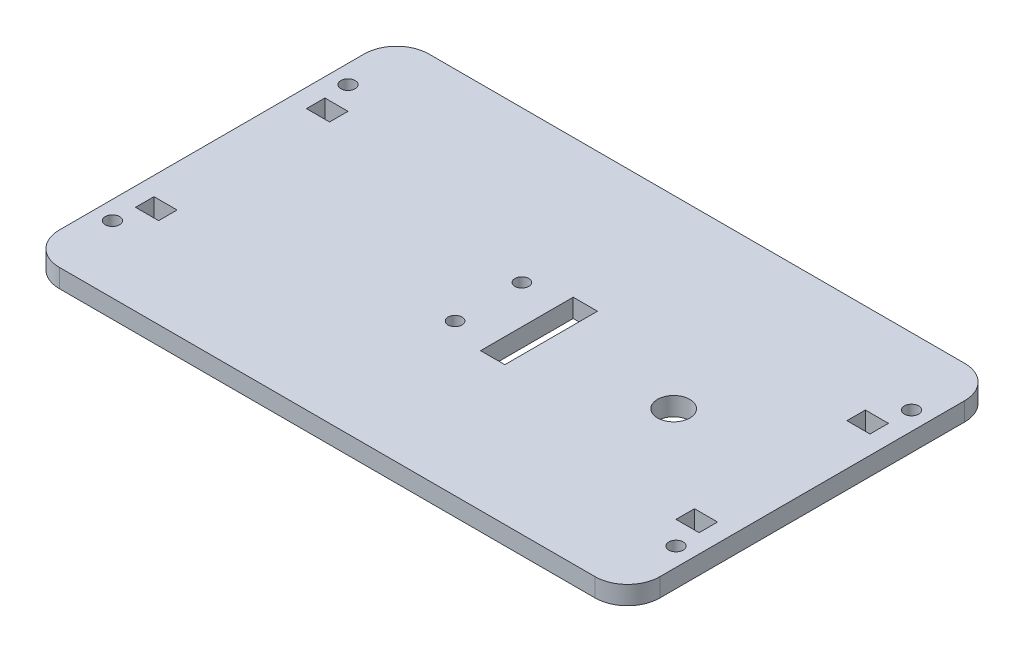
ISO-10303-21;
HEADER;
FILE_DESCRIPTION(('STEP AP214'),'2;1');
FILE_NAME('part.step','',(''),(''),'','','');
FILE_SCHEMA(('AUTOMOTIVE_DESIGN { 1 0 10303 214 1 1 1 1 }'));
ENDSEC;
DATA;
#1=APPLICATION_CONTEXT('core data for automotive mechanical design processes');
#2=APPLICATION_PROTOCOL_DEFINITION('international standard','automotive_design',2000,#1);
#3=PRODUCT_CONTEXT('',#1,'mechanical');
#4=PRODUCT('Part','Part','',(#3));
#5=PRODUCT_RELATED_PRODUCT_CATEGORY('part','',(#4));
#6=PRODUCT_DEFINITION_FORMATION('','',#4);
#7=PRODUCT_DEFINITION_CONTEXT('part definition',#1,'design');
#8=PRODUCT_DEFINITION('design','',#6,#7);
#9=PRODUCT_DEFINITION_SHAPE('','',#8);
#10=(LENGTH_UNIT() NAMED_UNIT(*) SI_UNIT(.MILLI.,.METRE.));
#11=(NAMED_UNIT(*) PLANE_ANGLE_UNIT() SI_UNIT($,.RADIAN.));
#12=(NAMED_UNIT(*) SI_UNIT($,.STERADIAN.) SOLID_ANGLE_UNIT());
#13=UNCERTAINTY_MEASURE_WITH_UNIT(LENGTH_MEASURE(1.E-05),#10,'distance_accuracy_value','');
#14=(GEOMETRIC_REPRESENTATION_CONTEXT(3) GLOBAL_UNCERTAINTY_ASSIGNED_CONTEXT((#13)) GLOBAL_UNIT_ASSIGNED_CONTEXT((#10,
#11,#12)) REPRESENTATION_CONTEXT('',''));
#15=CARTESIAN_POINT('',(0.,0.,0.));
#16=DIRECTION('',(0.,0.,1.));
#17=DIRECTION('',(1.,0.,0.));
#18=AXIS2_PLACEMENT_3D('',#15,#16,#17);
#19=CARTESIAN_POINT('',(58.,4.,-33.));
#20=DIRECTION('',(0.,-1.,0.));
#21=DIRECTION('',(0.,0.,-1.));
#22=AXIS2_PLACEMENT_3D('',#19,#20,#21);
#23=PLANE('',#22);
#24=CARTESIAN_POINT('',(-5.10000000000001,4.,-7.22749999999999));
#25=DIRECTION('',(0.,1.,0.));
#26=DIRECTION('',(0.,0.,1.));
#27=AXIS2_PLACEMENT_3D('',#24,#25,#26);
#28=CIRCLE('',#27,1.5);
#29=CARTESIAN_POINT('',(-5.10000000000001,4.,-5.72749999999999));
#30=VERTEX_POINT('',#29);
#31=EDGE_CURVE('E258',#30,#30,#28,.T.);
#32=ORIENTED_EDGE('',*,*,#31,.F.);
#33=EDGE_LOOP('',(#32));
#34=FACE_BOUND('',#33,.T.);
#35=CARTESIAN_POINT('',(-5.10000000000001,4.,7.22750000000001));
#36=DIRECTION('',(0.,1.,0.));
#37=DIRECTION('',(0.,0.,1.));
#38=AXIS2_PLACEMENT_3D('',#35,#36,#37);
#39=CIRCLE('',#38,1.5);
#40=CARTESIAN_POINT('',(-5.10000000000001,4.,8.72750000000001));
#41=VERTEX_POINT('',#40);
#42=EDGE_CURVE('E264',#41,#41,#39,.T.);
#43=ORIENTED_EDGE('',*,*,#42,.F.);
#44=EDGE_LOOP('',(#43));
#45=FACE_BOUND('',#44,.T.);
#46=CARTESIAN_POINT('',(-61.,4.,-25.5));
#47=DIRECTION('',(0.,1.,0.));
#48=DIRECTION('',(0.,0.,-1.));
#49=AXIS2_PLACEMENT_3D('',#46,#47,#48);
#50=CIRCLE('',#49,1.54999999999999);
#51=CARTESIAN_POINT('',(-61.,4.,-27.05));
#52=VERTEX_POINT('',#51);
#53=EDGE_CURVE('E270',#52,#52,#50,.T.);
#54=ORIENTED_EDGE('',*,*,#53,.F.);
#55=EDGE_LOOP('',(#54));
#56=FACE_BOUND('',#55,.T.);
#57=CARTESIAN_POINT('',(-61.,4.,25.5));
#58=DIRECTION('',(0.,1.,0.));
#59=DIRECTION('',(0.,0.,1.));
#60=AXIS2_PLACEMENT_3D('',#57,#58,#59);
#61=CIRCLE('',#60,1.54999999999999);
#62=CARTESIAN_POINT('',(-61.,4.,27.05));
#63=VERTEX_POINT('',#62);
#64=EDGE_CURVE('E276',#63,#63,#61,.T.);
#65=ORIENTED_EDGE('',*,*,#64,.F.);
#66=EDGE_LOOP('',(#65));
#67=FACE_BOUND('',#66,.T.);
#68=CARTESIAN_POINT('',(61.,4.,25.5));
#69=DIRECTION('',(0.,1.,0.));
#70=DIRECTION('',(0.,0.,-1.));
#71=AXIS2_PLACEMENT_3D('',#68,#69,#70);
#72=CIRCLE('',#71,1.54999999999999);
#73=CARTESIAN_POINT('',(61.,4.,23.95));
#74=VERTEX_POINT('',#73);
#75=EDGE_CURVE('E282',#74,#74,#72,.T.);
#76=ORIENTED_EDGE('',*,*,#75,.F.);
#77=EDGE_LOOP('',(#76));
#78=FACE_BOUND('',#77,.T.);
#79=CARTESIAN_POINT('',(61.,4.,-25.5));
#80=DIRECTION('',(0.,1.,0.));
#81=DIRECTION('',(0.,0.,1.));
#82=AXIS2_PLACEMENT_3D('',#79,#80,#81);
#83=CIRCLE('',#82,1.54999999999999);
#84=CARTESIAN_POINT('',(61.,4.,-23.95));
#85=VERTEX_POINT('',#84);
#86=EDGE_CURVE('E288',#85,#85,#83,.T.);
#87=ORIENTED_EDGE('',*,*,#86,.F.);
#88=EDGE_LOOP('',(#87));
#89=FACE_BOUND('',#88,.T.);
#90=DIRECTION('',(0.,0.,1.));
#91=VECTOR('',#90,1.);
#92=CARTESIAN_POINT('',(-61.,4.,-20.5));
#93=LINE('',#92,#91);
#94=CARTESIAN_POINT('',(-61.,4.,-20.5));
#95=VERTEX_POINT('',#94);
#96=CARTESIAN_POINT('',(-61.,4.,-16.5));
#97=VERTEX_POINT('',#96);
#98=EDGE_CURVE('E294',#95,#97,#93,.T.);
#99=ORIENTED_EDGE('',*,*,#98,.F.);
#100=DIRECTION('',(-1.,0.,0.));
#101=VECTOR('',#100,1.);
#102=CARTESIAN_POINT('',(-61.,4.,-20.5));
#103=LINE('',#102,#101);
#104=CARTESIAN_POINT('',(-56.,4.,-20.5));
#105=VERTEX_POINT('',#104);
#106=EDGE_CURVE('E302',#105,#95,#103,.T.);
#107=ORIENTED_EDGE('',*,*,#106,.F.);
#108=DIRECTION('',(0.,0.,-1.));
#109=VECTOR('',#108,1.);
#110=CARTESIAN_POINT('',(-56.,4.,-20.5));
#111=LINE('',#110,#109);
#112=CARTESIAN_POINT('',(-56.,4.,-16.5));
#113=VERTEX_POINT('',#112);
#114=EDGE_CURVE('E299',#113,#105,#111,.T.);
#115=ORIENTED_EDGE('',*,*,#114,.F.);
#116=DIRECTION('',(1.,0.,0.));
#117=VECTOR('',#116,1.);
#118=CARTESIAN_POINT('',(-61.,4.,-16.5));
#119=LINE('',#118,#117);
#120=EDGE_CURVE('E296',#97,#113,#119,.T.);
#121=ORIENTED_EDGE('',*,*,#120,.F.);
#122=EDGE_LOOP('',(#99,#107,#115,#121));
#123=FACE_BOUND('',#122,.T.);
#124=DIRECTION('',(0.,0.,-1.));
#125=VECTOR('',#124,1.);
#126=CARTESIAN_POINT('',(61.,4.,20.5));
#127=LINE('',#126,#125);
#128=CARTESIAN_POINT('',(61.,4.,20.5));
#129=VERTEX_POINT('',#128);
#130=CARTESIAN_POINT('',(61.,4.,16.5));
#131=VERTEX_POINT('',#130);
#132=EDGE_CURVE('E356',#129,#131,#127,.T.);
#133=ORIENTED_EDGE('',*,*,#132,.F.);
#134=DIRECTION('',(1.,0.,0.));
#135=VECTOR('',#134,1.);
#136=CARTESIAN_POINT('',(61.,4.,20.5));
#137=LINE('',#136,#135);
#138=CARTESIAN_POINT('',(56.,4.,20.5));
#139=VERTEX_POINT('',#138);
#140=EDGE_CURVE('E364',#139,#129,#137,.T.);
#141=ORIENTED_EDGE('',*,*,#140,.F.);
#142=DIRECTION('',(0.,0.,1.));
#143=VECTOR('',#142,1.);
#144=CARTESIAN_POINT('',(56.,4.,20.5));
#145=LINE('',#144,#143);
#146=CARTESIAN_POINT('',(56.,4.,16.5));
#147=VERTEX_POINT('',#146);
#148=EDGE_CURVE('E361',#147,#139,#145,.T.);
#149=ORIENTED_EDGE('',*,*,#148,.F.);
#150=DIRECTION('',(-1.,0.,0.));
#151=VECTOR('',#150,1.);
#152=CARTESIAN_POINT('',(61.,4.,16.5));
#153=LINE('',#152,#151);
#154=EDGE_CURVE('E358',#131,#147,#153,.T.);
#155=ORIENTED_EDGE('',*,*,#154,.F.);
#156=EDGE_LOOP('',(#133,#141,#149,#155));
#157=FACE_BOUND('',#156,.T.);
#158=CARTESIAN_POINT('',(58.,4.,-33.));
#159=DIRECTION('',(0.,1.,0.));
#160=DIRECTION('',(0.,0.,-1.));
#161=AXIS2_PLACEMENT_3D('',#158,#159,#160);
#162=CIRCLE('',#161,7.);
#163=CARTESIAN_POINT('',(65.,4.,-32.9999999999999));
#164=VERTEX_POINT('',#163);
#165=CARTESIAN_POINT('',(57.9999999999999,4.,-40.));
#166=VERTEX_POINT('',#165);
#167=EDGE_CURVE('E418',#164,#166,#162,.T.);
#168=ORIENTED_EDGE('',*,*,#167,.T.);
#169=DIRECTION('',(-1.,0.,0.));
#170=VECTOR('',#169,1.);
#171=CARTESIAN_POINT('',(-58.,4.,-40.));
#172=LINE('',#171,#170);
#173=CARTESIAN_POINT('',(-58.,4.,-40.));
#174=VERTEX_POINT('',#173);
#175=EDGE_CURVE('E421',#166,#174,#172,.T.);
#176=ORIENTED_EDGE('',*,*,#175,.T.);
#177=CARTESIAN_POINT('',(-58.,4.,-33.));
#178=DIRECTION('',(0.,1.,0.));
#179=DIRECTION('',(0.,0.,-1.));
#180=AXIS2_PLACEMENT_3D('',#177,#178,#179);
#181=CIRCLE('',#180,7.);
#182=CARTESIAN_POINT('',(-65.,4.,-32.9999999999999));
#183=VERTEX_POINT('',#182);
#184=EDGE_CURVE('E424',#174,#183,#181,.T.);
#185=ORIENTED_EDGE('',*,*,#184,.T.);
#186=DIRECTION('',(0.,0.,1.));
#187=VECTOR('',#186,1.);
#188=CARTESIAN_POINT('',(-65.,4.,33.));
#189=LINE('',#188,#187);
#190=CARTESIAN_POINT('',(-65.,4.,33.));
#191=VERTEX_POINT('',#190);
#192=EDGE_CURVE('E426',#183,#191,#189,.T.);
#193=ORIENTED_EDGE('',*,*,#192,.T.);
#194=CARTESIAN_POINT('',(-58.,4.,33.));
#195=DIRECTION('',(0.,1.,0.));
#196=DIRECTION('',(0.,0.,-1.));
#197=AXIS2_PLACEMENT_3D('',#194,#195,#196);
#198=CIRCLE('',#197,7.);
#199=CARTESIAN_POINT('',(-58.,4.,40.));
#200=VERTEX_POINT('',#199);
#201=EDGE_CURVE('E428',#191,#200,#198,.T.);
#202=ORIENTED_EDGE('',*,*,#201,.T.);
#203=DIRECTION('',(1.,0.,0.));
#204=VECTOR('',#203,1.);
#205=CARTESIAN_POINT('',(-58.,4.,40.));
#206=LINE('',#205,#204);
#207=CARTESIAN_POINT('',(57.9999999999999,4.,40.));
#208=VERTEX_POINT('',#207);
#209=EDGE_CURVE('E430',#200,#208,#206,.T.);
#210=ORIENTED_EDGE('',*,*,#209,.T.);
#211=CARTESIAN_POINT('',(58.,4.,33.));
#212=DIRECTION('',(0.,1.,0.));
#213=DIRECTION('',(0.,0.,1.));
#214=AXIS2_PLACEMENT_3D('',#211,#212,#213);
#215=CIRCLE('',#214,7.);
#216=CARTESIAN_POINT('',(65.,4.,33.));
#217=VERTEX_POINT('',#216);
#218=EDGE_CURVE('E432',#208,#217,#215,.T.);
#219=ORIENTED_EDGE('',*,*,#218,.T.);
#220=DIRECTION('',(0.,0.,-1.));
#221=VECTOR('',#220,1.);
#222=CARTESIAN_POINT('',(65.,4.,33.));
#223=LINE('',#222,#221);
#224=EDGE_CURVE('E434',#217,#164,#223,.T.);
#225=ORIENTED_EDGE('',*,*,#224,.T.);
#226=EDGE_LOOP('',(#168,#176,#185,#193,#202,#210,#219,#225));
#227=FACE_BOUND('',#226,.T.);
#228=DIRECTION('',(0.,0.,-1.));
#229=VECTOR('',#228,1.);
#230=CARTESIAN_POINT('',(61.,4.,-20.5));
#231=LINE('',#230,#229);
#232=CARTESIAN_POINT('',(61.,4.,-16.5));
#233=VERTEX_POINT('',#232);
#234=CARTESIAN_POINT('',(61.,4.,-20.5));
#235=VERTEX_POINT('',#234);
#236=EDGE_CURVE('E387',#233,#235,#231,.T.);
#237=ORIENTED_EDGE('',*,*,#236,.F.);
#238=DIRECTION('',(1.,0.,0.));
#239=VECTOR('',#238,1.);
#240=CARTESIAN_POINT('',(61.,4.,-16.5));
#241=LINE('',#240,#239);
#242=CARTESIAN_POINT('',(56.,4.,-16.5));
#243=VERTEX_POINT('',#242);
#244=EDGE_CURVE('E395',#243,#233,#241,.T.);
#245=ORIENTED_EDGE('',*,*,#244,.F.);
#246=DIRECTION('',(0.,0.,1.));
#247=VECTOR('',#246,1.);
#248=CARTESIAN_POINT('',(56.,4.,-20.5));
#249=LINE('',#248,#247);
#250=CARTESIAN_POINT('',(56.,4.,-20.5));
#251=VERTEX_POINT('',#250);
#252=EDGE_CURVE('E392',#251,#243,#249,.T.);
#253=ORIENTED_EDGE('',*,*,#252,.F.);
#254=DIRECTION('',(-1.,0.,0.));
#255=VECTOR('',#254,1.);
#256=CARTESIAN_POINT('',(61.,4.,-20.5));
#257=LINE('',#256,#255);
#258=EDGE_CURVE('E389',#235,#251,#257,.T.);
#259=ORIENTED_EDGE('',*,*,#258,.F.);
#260=EDGE_LOOP('',(#237,#245,#253,#259));
#261=FACE_BOUND('',#260,.T.);
#262=DIRECTION('',(1.,0.,0.));
#263=VECTOR('',#262,1.);
#264=CARTESIAN_POINT('',(-61.,4.,20.5));
#265=LINE('',#264,#263);
#266=CARTESIAN_POINT('',(-61.,4.,20.5));
#267=VERTEX_POINT('',#266);
#268=CARTESIAN_POINT('',(-56.,4.,20.5));
#269=VERTEX_POINT('',#268);
#270=EDGE_CURVE('E325',#267,#269,#265,.T.);
#271=ORIENTED_EDGE('',*,*,#270,.F.);
#272=DIRECTION('',(0.,0.,1.));
#273=VECTOR('',#272,1.);
#274=CARTESIAN_POINT('',(-61.,4.,20.5));
#275=LINE('',#274,#273);
#276=CARTESIAN_POINT('',(-61.,4.,16.5));
#277=VERTEX_POINT('',#276);
#278=EDGE_CURVE('E333',#277,#267,#275,.T.);
#279=ORIENTED_EDGE('',*,*,#278,.F.);
#280=DIRECTION('',(-1.,0.,0.));
#281=VECTOR('',#280,1.);
#282=CARTESIAN_POINT('',(-61.,4.,16.5));
#283=LINE('',#282,#281);
#284=CARTESIAN_POINT('',(-56.,4.,16.5));
#285=VERTEX_POINT('',#284);
#286=EDGE_CURVE('E330',#285,#277,#283,.T.);
#287=ORIENTED_EDGE('',*,*,#286,.F.);
#288=DIRECTION('',(0.,0.,-1.));
#289=VECTOR('',#288,1.);
#290=CARTESIAN_POINT('',(-56.,4.,20.5));
#291=LINE('',#290,#289);
#292=EDGE_CURVE('E327',#269,#285,#291,.T.);
#293=ORIENTED_EDGE('',*,*,#292,.F.);
#294=EDGE_LOOP('',(#271,#279,#287,#293));
#295=FACE_BOUND('',#294,.T.);
#296=DIRECTION('',(0.,0.,1.));
#297=VECTOR('',#296,1.);
#298=CARTESIAN_POINT('',(3.22232031120961,4.,-10.0275));
#299=LINE('',#298,#297);
#300=CARTESIAN_POINT('',(3.22232031120961,4.,-10.0275));
#301=VERTEX_POINT('',#300);
#302=CARTESIAN_POINT('',(3.22232031120962,4.,10.0275));
#303=VERTEX_POINT('',#302);
#304=EDGE_CURVE('E219',#301,#303,#299,.T.);
#305=ORIENTED_EDGE('',*,*,#304,.F.);
#306=DIRECTION('',(-1.,0.,0.));
#307=VECTOR('',#306,1.);
#308=CARTESIAN_POINT('',(3.22232031120961,4.,-10.0275));
#309=LINE('',#308,#307);
#310=CARTESIAN_POINT('',(8.47559016262878,4.,-10.0275));
#311=VERTEX_POINT('',#310);
#312=EDGE_CURVE('E242',#311,#301,#309,.T.);
#313=ORIENTED_EDGE('',*,*,#312,.F.);
#314=DIRECTION('',(0.,0.,-1.));
#315=VECTOR('',#314,1.);
#316=CARTESIAN_POINT('',(8.47559016262878,4.,-10.0275));
#317=LINE('',#316,#315);
#318=CARTESIAN_POINT('',(8.47559016262878,4.,10.0275));
#319=VERTEX_POINT('',#318);
#320=EDGE_CURVE('E240',#319,#311,#317,.T.);
#321=ORIENTED_EDGE('',*,*,#320,.F.);
#322=DIRECTION('',(1.,0.,0.));
#323=VECTOR('',#322,1.);
#324=CARTESIAN_POINT('',(3.22232031120962,4.,10.0275));
#325=LINE('',#324,#323);
#326=EDGE_CURVE('E227',#303,#319,#325,.T.);
#327=ORIENTED_EDGE('',*,*,#326,.F.);
#328=EDGE_LOOP('',(#305,#313,#321,#327));
#329=FACE_BOUND('',#328,.T.);
#330=CARTESIAN_POINT('',(35.,4.,0.));
#331=DIRECTION('',(0.,1.,0.));
#332=DIRECTION('',(0.,0.,1.));
#333=AXIS2_PLACEMENT_3D('',#330,#331,#332);
#334=CIRCLE('',#333,3.5);
#335=CARTESIAN_POINT('',(35.,4.,3.5));
#336=VERTEX_POINT('',#335);
#337=EDGE_CURVE('E248',#336,#336,#334,.T.);
#338=ORIENTED_EDGE('',*,*,#337,.F.);
#339=EDGE_LOOP('',(#338));
#340=FACE_BOUND('',#339,.T.);
#341=ADVANCED_FACE('F34',(#34,#45,#56,#67,#78,#89,#123,#157,#227,#261,#295,#329,#340),#23,.F.);
#342=CARTESIAN_POINT('',(58.,0.,-33.));
#343=DIRECTION('',(0.,-1.,0.));
#344=DIRECTION('',(0.,0.,-1.));
#345=AXIS2_PLACEMENT_3D('',#342,#343,#344);
#346=PLANE('',#345);
#347=DIRECTION('',(-1.,0.,0.));
#348=VECTOR('',#347,1.);
#349=CARTESIAN_POINT('',(3.22232031120961,0.,-10.0275));
#350=LINE('',#349,#348);
#351=CARTESIAN_POINT('',(8.47559016262878,0.,-10.0275));
#352=VERTEX_POINT('',#351);
#353=CARTESIAN_POINT('',(3.22232031120961,0.,-10.0275));
#354=VERTEX_POINT('',#353);
#355=EDGE_CURVE('E228',#352,#354,#350,.T.);
#356=ORIENTED_EDGE('',*,*,#355,.T.);
#357=DIRECTION('',(0.,0.,1.));
#358=VECTOR('',#357,1.);
#359=CARTESIAN_POINT('',(3.22232031120961,0.,-10.0275));
#360=LINE('',#359,#358);
#361=CARTESIAN_POINT('',(3.22232031120962,0.,10.0275));
#362=VERTEX_POINT('',#361);
#363=EDGE_CURVE('E57',#354,#362,#360,.T.);
#364=ORIENTED_EDGE('',*,*,#363,.T.);
#365=DIRECTION('',(1.,0.,0.));
#366=VECTOR('',#365,1.);
#367=CARTESIAN_POINT('',(3.22232031120962,0.,10.0275));
#368=LINE('',#367,#366);
#369=CARTESIAN_POINT('',(8.47559016262878,0.,10.0275));
#370=VERTEX_POINT('',#369);
#371=EDGE_CURVE('E234',#362,#370,#368,.T.);
#372=ORIENTED_EDGE('',*,*,#371,.T.);
#373=DIRECTION('',(0.,0.,-1.));
#374=VECTOR('',#373,1.);
#375=CARTESIAN_POINT('',(8.47559016262878,0.,-10.0275));
#376=LINE('',#375,#374);
#377=EDGE_CURVE('E250',#370,#352,#376,.T.);
#378=ORIENTED_EDGE('',*,*,#377,.T.);
#379=EDGE_LOOP('',(#356,#364,#372,#378));
#380=FACE_BOUND('',#379,.T.);
#381=CARTESIAN_POINT('',(-5.10000000000001,0.,-7.22749999999999));
#382=DIRECTION('',(0.,1.,0.));
#383=DIRECTION('',(0.,0.,1.));
#384=AXIS2_PLACEMENT_3D('',#381,#382,#383);
#385=CIRCLE('',#384,1.5);
#386=CARTESIAN_POINT('',(-5.10000000000001,0.,-5.72749999999999));
#387=VERTEX_POINT('',#386);
#388=EDGE_CURVE('E235',#387,#387,#385,.T.);
#389=ORIENTED_EDGE('',*,*,#388,.T.);
#390=EDGE_LOOP('',(#389));
#391=FACE_BOUND('',#390,.T.);
#392=CARTESIAN_POINT('',(-61.,0.,-25.5));
#393=DIRECTION('',(0.,1.,0.));
#394=DIRECTION('',(0.,0.,-1.));
#395=AXIS2_PLACEMENT_3D('',#392,#393,#394);
#396=CIRCLE('',#395,1.54999999999999);
#397=CARTESIAN_POINT('',(-61.,0.,-27.05));
#398=VERTEX_POINT('',#397);
#399=EDGE_CURVE('E267',#398,#398,#396,.T.);
#400=ORIENTED_EDGE('',*,*,#399,.T.);
#401=EDGE_LOOP('',(#400));
#402=FACE_BOUND('',#401,.T.);
#403=CARTESIAN_POINT('',(61.,0.,25.5));
#404=DIRECTION('',(0.,1.,0.));
#405=DIRECTION('',(0.,0.,-1.));
#406=AXIS2_PLACEMENT_3D('',#403,#404,#405);
#407=CIRCLE('',#406,1.54999999999999);
#408=CARTESIAN_POINT('',(61.,0.,23.95));
#409=VERTEX_POINT('',#408);
#410=EDGE_CURVE('E279',#409,#409,#407,.T.);
#411=ORIENTED_EDGE('',*,*,#410,.T.);
#412=EDGE_LOOP('',(#411));
#413=FACE_BOUND('',#412,.T.);
#414=DIRECTION('',(-1.,0.,0.));
#415=VECTOR('',#414,1.);
#416=CARTESIAN_POINT('',(-61.,0.,-20.5));
#417=LINE('',#416,#415);
#418=CARTESIAN_POINT('',(-56.,0.,-20.5));
#419=VERTEX_POINT('',#418);
#420=CARTESIAN_POINT('',(-61.,0.,-20.5));
#421=VERTEX_POINT('',#420);
#422=EDGE_CURVE('E297',#419,#421,#417,.T.);
#423=ORIENTED_EDGE('',*,*,#422,.T.);
#424=DIRECTION('',(0.,0.,1.));
#425=VECTOR('',#424,1.);
#426=CARTESIAN_POINT('',(-61.,0.,-20.5));
#427=LINE('',#426,#425);
#428=CARTESIAN_POINT('',(-61.,0.,-16.5));
#429=VERTEX_POINT('',#428);
#430=EDGE_CURVE('E291',#421,#429,#427,.T.);
#431=ORIENTED_EDGE('',*,*,#430,.T.);
#432=DIRECTION('',(1.,0.,0.));
#433=VECTOR('',#432,1.);
#434=CARTESIAN_POINT('',(-61.,0.,-16.5));
#435=LINE('',#434,#433);
#436=CARTESIAN_POINT('',(-56.,0.,-16.5));
#437=VERTEX_POINT('',#436);
#438=EDGE_CURVE('E307',#429,#437,#435,.T.);
#439=ORIENTED_EDGE('',*,*,#438,.T.);
#440=DIRECTION('',(0.,0.,-1.));
#441=VECTOR('',#440,1.);
#442=CARTESIAN_POINT('',(-56.,0.,-20.5));
#443=LINE('',#442,#441);
#444=EDGE_CURVE('E310',#437,#419,#443,.T.);
#445=ORIENTED_EDGE('',*,*,#444,.T.);
#446=EDGE_LOOP('',(#423,#431,#439,#445));
#447=FACE_BOUND('',#446,.T.);
#448=DIRECTION('',(0.,0.,1.));
#449=VECTOR('',#448,1.);
#450=CARTESIAN_POINT('',(-61.,0.,20.5));
#451=LINE('',#450,#449);
#452=CARTESIAN_POINT('',(-61.,0.,16.5));
#453=VERTEX_POINT('',#452);
#454=CARTESIAN_POINT('',(-61.,0.,20.5));
#455=VERTEX_POINT('',#454);
#456=EDGE_CURVE('E328',#453,#455,#451,.T.);
#457=ORIENTED_EDGE('',*,*,#456,.T.);
#458=DIRECTION('',(1.,0.,0.));
#459=VECTOR('',#458,1.);
#460=CARTESIAN_POINT('',(-61.,0.,20.5));
#461=LINE('',#460,#459);
#462=CARTESIAN_POINT('',(-56.,0.,20.5));
#463=VERTEX_POINT('',#462);
#464=EDGE_CURVE('E324',#455,#463,#461,.T.);
#465=ORIENTED_EDGE('',*,*,#464,.T.);
#466=DIRECTION('',(0.,0.,-1.));
#467=VECTOR('',#466,1.);
#468=CARTESIAN_POINT('',(-56.,0.,20.5));
#469=LINE('',#468,#467);
#470=CARTESIAN_POINT('',(-56.,0.,16.5));
#471=VERTEX_POINT('',#470);
#472=EDGE_CURVE('E338',#463,#471,#469,.T.);
#473=ORIENTED_EDGE('',*,*,#472,.T.);
#474=DIRECTION('',(-1.,0.,0.));
#475=VECTOR('',#474,1.);
#476=CARTESIAN_POINT('',(-61.,0.,16.5));
#477=LINE('',#476,#475);
#478=EDGE_CURVE('E341',#471,#453,#477,.T.);
#479=ORIENTED_EDGE('',*,*,#478,.T.);
#480=EDGE_LOOP('',(#457,#465,#473,#479));
#481=FACE_BOUND('',#480,.T.);
#482=DIRECTION('',(1.,0.,0.));
#483=VECTOR('',#482,1.);
#484=CARTESIAN_POINT('',(61.,0.,20.5));
#485=LINE('',#484,#483);
#486=CARTESIAN_POINT('',(56.,0.,20.5));
#487=VERTEX_POINT('',#486);
#488=CARTESIAN_POINT('',(61.,0.,20.5));
#489=VERTEX_POINT('',#488);
#490=EDGE_CURVE('E359',#487,#489,#485,.T.);
#491=ORIENTED_EDGE('',*,*,#490,.T.);
#492=DIRECTION('',(0.,0.,-1.));
#493=VECTOR('',#492,1.);
#494=CARTESIAN_POINT('',(61.,0.,20.5));
#495=LINE('',#494,#493);
#496=CARTESIAN_POINT('',(61.,0.,16.5));
#497=VERTEX_POINT('',#496);
#498=EDGE_CURVE('E355',#489,#497,#495,.T.);
#499=ORIENTED_EDGE('',*,*,#498,.T.);
#500=DIRECTION('',(-1.,0.,0.));
#501=VECTOR('',#500,1.);
#502=CARTESIAN_POINT('',(61.,0.,16.5));
#503=LINE('',#502,#501);
#504=CARTESIAN_POINT('',(56.,0.,16.5));
#505=VERTEX_POINT('',#504);
#506=EDGE_CURVE('E369',#497,#505,#503,.T.);
#507=ORIENTED_EDGE('',*,*,#506,.T.);
#508=DIRECTION('',(0.,0.,1.));
#509=VECTOR('',#508,1.);
#510=CARTESIAN_POINT('',(56.,0.,20.5));
#511=LINE('',#510,#509);
#512=EDGE_CURVE('E372',#505,#487,#511,.T.);
#513=ORIENTED_EDGE('',*,*,#512,.T.);
#514=EDGE_LOOP('',(#491,#499,#507,#513));
#515=FACE_BOUND('',#514,.T.);
#516=DIRECTION('',(1.,0.,0.));
#517=VECTOR('',#516,1.);
#518=CARTESIAN_POINT('',(61.,0.,-16.5));
#519=LINE('',#518,#517);
#520=CARTESIAN_POINT('',(56.,0.,-16.5));
#521=VERTEX_POINT('',#520);
#522=CARTESIAN_POINT('',(61.,0.,-16.5));
#523=VERTEX_POINT('',#522);
#524=EDGE_CURVE('E390',#521,#523,#519,.T.);
#525=ORIENTED_EDGE('',*,*,#524,.T.);
#526=DIRECTION('',(0.,0.,-1.));
#527=VECTOR('',#526,1.);
#528=CARTESIAN_POINT('',(61.,0.,-20.5));
#529=LINE('',#528,#527);
#530=CARTESIAN_POINT('',(61.,0.,-20.5));
#531=VERTEX_POINT('',#530);
#532=EDGE_CURVE('E386',#523,#531,#529,.T.);
#533=ORIENTED_EDGE('',*,*,#532,.T.);
#534=DIRECTION('',(-1.,0.,0.));
#535=VECTOR('',#534,1.);
#536=CARTESIAN_POINT('',(61.,0.,-20.5));
#537=LINE('',#536,#535);
#538=CARTESIAN_POINT('',(56.,0.,-20.5));
#539=VERTEX_POINT('',#538);
#540=EDGE_CURVE('E400',#531,#539,#537,.T.);
#541=ORIENTED_EDGE('',*,*,#540,.T.);
#542=DIRECTION('',(0.,0.,1.));
#543=VECTOR('',#542,1.);
#544=CARTESIAN_POINT('',(56.,0.,-20.5));
#545=LINE('',#544,#543);
#546=EDGE_CURVE('E403',#539,#521,#545,.T.);
#547=ORIENTED_EDGE('',*,*,#546,.T.);
#548=EDGE_LOOP('',(#525,#533,#541,#547));
#549=FACE_BOUND('',#548,.T.);
#550=CARTESIAN_POINT('',(58.,0.,-33.));
#551=DIRECTION('',(0.,1.,0.));
#552=DIRECTION('',(0.,0.,-1.));
#553=AXIS2_PLACEMENT_3D('',#550,#551,#552);
#554=CIRCLE('',#553,7.);
#555=CARTESIAN_POINT('',(65.,0.,-32.9999999999999));
#556=VERTEX_POINT('',#555);
#557=CARTESIAN_POINT('',(57.9999999999999,0.,-40.));
#558=VERTEX_POINT('',#557);
#559=EDGE_CURVE('E417',#556,#558,#554,.T.);
#560=ORIENTED_EDGE('',*,*,#559,.F.);
#561=DIRECTION('',(0.,0.,-1.));
#562=VECTOR('',#561,1.);
#563=CARTESIAN_POINT('',(65.,0.,33.));
#564=LINE('',#563,#562);
#565=CARTESIAN_POINT('',(65.,0.,33.));
#566=VERTEX_POINT('',#565);
#567=EDGE_CURVE('E422',#566,#556,#564,.T.);
#568=ORIENTED_EDGE('',*,*,#567,.F.);
#569=CARTESIAN_POINT('',(58.,0.,33.));
#570=DIRECTION('',(0.,1.,0.));
#571=DIRECTION('',(0.,0.,1.));
#572=AXIS2_PLACEMENT_3D('',#569,#570,#571);
#573=CIRCLE('',#572,7.);
#574=CARTESIAN_POINT('',(57.9999999999999,0.,40.));
#575=VERTEX_POINT('',#574);
#576=EDGE_CURVE('E449',#575,#566,#573,.T.);
#577=ORIENTED_EDGE('',*,*,#576,.F.);
#578=DIRECTION('',(1.,0.,0.));
#579=VECTOR('',#578,1.);
#580=CARTESIAN_POINT('',(-58.,0.,40.));
#581=LINE('',#580,#579);
#582=CARTESIAN_POINT('',(-58.,0.,40.));
#583=VERTEX_POINT('',#582);
#584=EDGE_CURVE('E447',#583,#575,#581,.T.);
#585=ORIENTED_EDGE('',*,*,#584,.F.);
#586=CARTESIAN_POINT('',(-58.,0.,33.));
#587=DIRECTION('',(0.,1.,0.));
#588=DIRECTION('',(0.,0.,-1.));
#589=AXIS2_PLACEMENT_3D('',#586,#587,#588);
#590=CIRCLE('',#589,7.);
#591=CARTESIAN_POINT('',(-65.,0.,33.));
#592=VERTEX_POINT('',#591);
#593=EDGE_CURVE('E445',#592,#583,#590,.T.);
#594=ORIENTED_EDGE('',*,*,#593,.F.);
#595=DIRECTION('',(0.,0.,1.));
#596=VECTOR('',#595,1.);
#597=CARTESIAN_POINT('',(-65.,0.,33.));
#598=LINE('',#597,#596);
#599=CARTESIAN_POINT('',(-65.,0.,-32.9999999999999));
#600=VERTEX_POINT('',#599);
#601=EDGE_CURVE('E443',#600,#592,#598,.T.);
#602=ORIENTED_EDGE('',*,*,#601,.F.);
#603=CARTESIAN_POINT('',(-58.,0.,-33.));
#604=DIRECTION('',(0.,1.,0.));
#605=DIRECTION('',(0.,0.,-1.));
#606=AXIS2_PLACEMENT_3D('',#603,#604,#605);
#607=CIRCLE('',#606,7.);
#608=CARTESIAN_POINT('',(-58.,0.,-40.));
#609=VERTEX_POINT('',#608);
#610=EDGE_CURVE('E441',#609,#600,#607,.T.);
#611=ORIENTED_EDGE('',*,*,#610,.F.);
#612=DIRECTION('',(-1.,0.,0.));
#613=VECTOR('',#612,1.);
#614=CARTESIAN_POINT('',(-58.,0.,-40.));
#615=LINE('',#614,#613);
#616=EDGE_CURVE('E439',#558,#609,#615,.T.);
#617=ORIENTED_EDGE('',*,*,#616,.F.);
#618=EDGE_LOOP('',(#560,#568,#577,#585,#594,#602,#611,#617));
#619=FACE_BOUND('',#618,.T.);
#620=CARTESIAN_POINT('',(61.,0.,-25.5));
#621=DIRECTION('',(0.,1.,0.));
#622=DIRECTION('',(0.,0.,1.));
#623=AXIS2_PLACEMENT_3D('',#620,#621,#622);
#624=CIRCLE('',#623,1.54999999999999);
#625=CARTESIAN_POINT('',(61.,0.,-23.95));
#626=VERTEX_POINT('',#625);
#627=EDGE_CURVE('E285',#626,#626,#624,.T.);
#628=ORIENTED_EDGE('',*,*,#627,.T.);
#629=EDGE_LOOP('',(#628));
#630=FACE_BOUND('',#629,.T.);
#631=CARTESIAN_POINT('',(-61.,0.,25.5));
#632=DIRECTION('',(0.,1.,0.));
#633=DIRECTION('',(0.,0.,1.));
#634=AXIS2_PLACEMENT_3D('',#631,#632,#633);
#635=CIRCLE('',#634,1.54999999999999);
#636=CARTESIAN_POINT('',(-61.,0.,27.05));
#637=VERTEX_POINT('',#636);
#638=EDGE_CURVE('E273',#637,#637,#635,.T.);
#639=ORIENTED_EDGE('',*,*,#638,.T.);
#640=EDGE_LOOP('',(#639));
#641=FACE_BOUND('',#640,.T.);
#642=CARTESIAN_POINT('',(-5.10000000000001,0.,7.22750000000001));
#643=DIRECTION('',(0.,1.,0.));
#644=DIRECTION('',(0.,0.,1.));
#645=AXIS2_PLACEMENT_3D('',#642,#643,#644);
#646=CIRCLE('',#645,1.5);
#647=CARTESIAN_POINT('',(-5.10000000000001,0.,8.72750000000001));
#648=VERTEX_POINT('',#647);
#649=EDGE_CURVE('E261',#648,#648,#646,.T.);
#650=ORIENTED_EDGE('',*,*,#649,.T.);
#651=EDGE_LOOP('',(#650));
#652=FACE_BOUND('',#651,.T.);
#653=CARTESIAN_POINT('',(35.,0.,0.));
#654=DIRECTION('',(0.,1.,0.));
#655=DIRECTION('',(0.,0.,1.));
#656=AXIS2_PLACEMENT_3D('',#653,#654,#655);
#657=CIRCLE('',#656,3.5);
#658=CARTESIAN_POINT('',(35.,0.,3.5));
#659=VERTEX_POINT('',#658);
#660=EDGE_CURVE('E803',#659,#659,#657,.T.);
#661=ORIENTED_EDGE('',*,*,#660,.T.);
#662=EDGE_LOOP('',(#661));
#663=FACE_BOUND('',#662,.T.);
#664=ADVANCED_FACE('F479',(#380,#391,#402,#413,#447,#481,#515,#549,#619,#630,#641,#652,#663),
#346,.T.);
#665=CARTESIAN_POINT('',(58.,4.,-33.));
#666=DIRECTION('',(0.,-1.,0.));
#667=DIRECTION('',(0.,0.,-1.));
#668=AXIS2_PLACEMENT_3D('',#665,#666,#667);
#669=CYLINDRICAL_SURFACE('',#668,7.);
#670=ORIENTED_EDGE('',*,*,#559,.T.);
#671=DIRECTION('',(0.,-1.,0.));
#672=VECTOR('',#671,1.);
#673=CARTESIAN_POINT('',(57.9999999999999,4.,-40.));
#674=LINE('',#673,#672);
#675=EDGE_CURVE('E11',#166,#558,#674,.T.);
#676=ORIENTED_EDGE('',*,*,#675,.F.);
#677=ORIENTED_EDGE('',*,*,#167,.F.);
#678=DIRECTION('',(0.,-1.,0.));
#679=VECTOR('',#678,1.);
#680=CARTESIAN_POINT('',(65.,4.,-32.9999999999999));
#681=LINE('',#680,#679);
#682=EDGE_CURVE('E436',#164,#556,#681,.T.);
#683=ORIENTED_EDGE('',*,*,#682,.T.);
#684=EDGE_LOOP('',(#670,#676,#677,#683));
#685=FACE_BOUND('',#684,.T.);
#686=ADVANCED_FACE('F36',(#685),#669,.T.);
#687=CARTESIAN_POINT('',(-58.,4.,-40.));
#688=DIRECTION('',(0.,0.,1.));
#689=DIRECTION('',(1.,0.,0.));
#690=AXIS2_PLACEMENT_3D('',#687,#688,#689);
#691=PLANE('',#690);
#692=ORIENTED_EDGE('',*,*,#616,.T.);
#693=DIRECTION('',(0.,-1.,0.));
#694=VECTOR('',#693,1.);
#695=CARTESIAN_POINT('',(-58.,4.,-40.));
#696=LINE('',#695,#694);
#697=EDGE_CURVE('E42',#174,#609,#696,.T.);
#698=ORIENTED_EDGE('',*,*,#697,.F.);
#699=ORIENTED_EDGE('',*,*,#175,.F.);
#700=ORIENTED_EDGE('',*,*,#675,.T.);
#701=EDGE_LOOP('',(#692,#698,#699,#700));
#702=FACE_BOUND('',#701,.T.);
#703=ADVANCED_FACE('F497',(#702),#691,.F.);
#704=CARTESIAN_POINT('',(-58.,4.,-33.));
#705=DIRECTION('',(0.,-1.,0.));
#706=DIRECTION('',(0.,0.,-1.));
#707=AXIS2_PLACEMENT_3D('',#704,#705,#706);
#708=CYLINDRICAL_SURFACE('',#707,7.);
#709=ORIENTED_EDGE('',*,*,#610,.T.);
#710=DIRECTION('',(0.,-1.,0.));
#711=VECTOR('',#710,1.);
#712=CARTESIAN_POINT('',(-65.,4.,-32.9999999999999));
#713=LINE('',#712,#711);
#714=EDGE_CURVE('E466',#183,#600,#713,.T.);
#715=ORIENTED_EDGE('',*,*,#714,.F.);
#716=ORIENTED_EDGE('',*,*,#184,.F.);
#717=ORIENTED_EDGE('',*,*,#697,.T.);
#718=EDGE_LOOP('',(#709,#715,#716,#717));
#719=FACE_BOUND('',#718,.T.);
#720=ADVANCED_FACE('F473',(#719),#708,.T.);
#721=CARTESIAN_POINT('',(-65.,4.,33.));
#722=DIRECTION('',(1.,0.,0.));
#723=DIRECTION('',(0.,0.,-1.));
#724=AXIS2_PLACEMENT_3D('',#721,#722,#723);
#725=PLANE('',#724);
#726=ORIENTED_EDGE('',*,*,#601,.T.);
#727=DIRECTION('',(0.,-1.,0.));
#728=VECTOR('',#727,1.);
#729=CARTESIAN_POINT('',(-65.,4.,33.));
#730=LINE('',#729,#728);
#731=EDGE_CURVE('E463',#191,#592,#730,.T.);
#732=ORIENTED_EDGE('',*,*,#731,.F.);
#733=ORIENTED_EDGE('',*,*,#192,.F.);
#734=ORIENTED_EDGE('',*,*,#714,.T.);
#735=EDGE_LOOP('',(#726,#732,#733,#734));
#736=FACE_BOUND('',#735,.T.);
#737=ADVANCED_FACE('F485',(#736),#725,.F.);
#738=CARTESIAN_POINT('',(-58.,4.,33.));
#739=DIRECTION('',(0.,-1.,0.));
#740=DIRECTION('',(0.,0.,-1.));
#741=AXIS2_PLACEMENT_3D('',#738,#739,#740);
#742=CYLINDRICAL_SURFACE('',#741,7.);
#743=ORIENTED_EDGE('',*,*,#593,.T.);
#744=DIRECTION('',(0.,-1.,0.));
#745=VECTOR('',#744,1.);
#746=CARTESIAN_POINT('',(-58.,4.,40.));
#747=LINE('',#746,#745);
#748=EDGE_CURVE('E460',#200,#583,#747,.T.);
#749=ORIENTED_EDGE('',*,*,#748,.F.);
#750=ORIENTED_EDGE('',*,*,#201,.F.);
#751=ORIENTED_EDGE('',*,*,#731,.T.);
#752=EDGE_LOOP('',(#743,#749,#750,#751));
#753=FACE_BOUND('',#752,.T.);
#754=ADVANCED_FACE('F489',(#753),#742,.T.);
#755=CARTESIAN_POINT('',(-58.,4.,40.));
#756=DIRECTION('',(0.,0.,-1.));
#757=DIRECTION('',(-1.,0.,0.));
#758=AXIS2_PLACEMENT_3D('',#755,#756,#757);
#759=PLANE('',#758);
#760=ORIENTED_EDGE('',*,*,#584,.T.);
#761=DIRECTION('',(0.,-1.,0.));
#762=VECTOR('',#761,1.);
#763=CARTESIAN_POINT('',(57.9999999999999,4.,40.));
#764=LINE('',#763,#762);
#765=EDGE_CURVE('E457',#208,#575,#764,.T.);
#766=ORIENTED_EDGE('',*,*,#765,.F.);
#767=ORIENTED_EDGE('',*,*,#209,.F.);
#768=ORIENTED_EDGE('',*,*,#748,.T.);
#769=EDGE_LOOP('',(#760,#766,#767,#768));
#770=FACE_BOUND('',#769,.T.);
#771=ADVANCED_FACE('F510',(#770),#759,.F.);
#772=CARTESIAN_POINT('',(58.,4.,33.));
#773=DIRECTION('',(0.,-1.,0.));
#774=DIRECTION('',(0.,0.,-1.));
#775=AXIS2_PLACEMENT_3D('',#772,#773,#774);
#776=CYLINDRICAL_SURFACE('',#775,7.);
#777=ORIENTED_EDGE('',*,*,#576,.T.);
#778=DIRECTION('',(0.,-1.,0.));
#779=VECTOR('',#778,1.);
#780=CARTESIAN_POINT('',(65.,4.,33.));
#781=LINE('',#780,#779);
#782=EDGE_CURVE('E454',#217,#566,#781,.T.);
#783=ORIENTED_EDGE('',*,*,#782,.F.);
#784=ORIENTED_EDGE('',*,*,#218,.F.);
#785=ORIENTED_EDGE('',*,*,#765,.T.);
#786=EDGE_LOOP('',(#777,#783,#784,#785));
#787=FACE_BOUND('',#786,.T.);
#788=ADVANCED_FACE('F508',(#787),#776,.T.);
#789=CARTESIAN_POINT('',(65.,4.,33.));
#790=DIRECTION('',(-1.,0.,0.));
#791=DIRECTION('',(0.,0.,1.));
#792=AXIS2_PLACEMENT_3D('',#789,#790,#791);
#793=PLANE('',#792);
#794=ORIENTED_EDGE('',*,*,#567,.T.);
#795=ORIENTED_EDGE('',*,*,#682,.F.);
#796=ORIENTED_EDGE('',*,*,#224,.F.);
#797=ORIENTED_EDGE('',*,*,#782,.T.);
#798=EDGE_LOOP('',(#794,#795,#796,#797));
#799=FACE_BOUND('',#798,.T.);
#800=ADVANCED_FACE('F503',(#799),#793,.F.);
#801=CARTESIAN_POINT('',(61.,4.,-20.5));
#802=DIRECTION('',(-1.,0.,0.));
#803=DIRECTION('',(0.,0.,1.));
#804=AXIS2_PLACEMENT_3D('',#801,#802,#803);
#805=PLANE('',#804);
#806=ORIENTED_EDGE('',*,*,#532,.F.);
#807=DIRECTION('',(0.,-1.,0.));
#808=VECTOR('',#807,1.);
#809=CARTESIAN_POINT('',(61.,4.,-16.5));
#810=LINE('',#809,#808);
#811=EDGE_CURVE('E397',#233,#523,#810,.T.);
#812=ORIENTED_EDGE('',*,*,#811,.F.);
#813=ORIENTED_EDGE('',*,*,#236,.T.);
#814=DIRECTION('',(0.,-1.,0.));
#815=VECTOR('',#814,1.);
#816=CARTESIAN_POINT('',(61.,4.,-20.5));
#817=LINE('',#816,#815);
#818=EDGE_CURVE('E414',#235,#531,#817,.T.);
#819=ORIENTED_EDGE('',*,*,#818,.T.);
#820=EDGE_LOOP('',(#806,#812,#813,#819));
#821=FACE_BOUND('',#820,.T.);
#822=ADVANCED_FACE('F530',(#821),#805,.T.);
#823=CARTESIAN_POINT('',(61.,4.,-20.5));
#824=DIRECTION('',(0.,0.,1.));
#825=DIRECTION('',(1.,0.,0.));
#826=AXIS2_PLACEMENT_3D('',#823,#824,#825);
#827=PLANE('',#826);
#828=ORIENTED_EDGE('',*,*,#540,.F.);
#829=ORIENTED_EDGE('',*,*,#818,.F.);
#830=ORIENTED_EDGE('',*,*,#258,.T.);
#831=DIRECTION('',(0.,-1.,0.));
#832=VECTOR('',#831,1.);
#833=CARTESIAN_POINT('',(56.,4.,-20.5));
#834=LINE('',#833,#832);
#835=EDGE_CURVE('E412',#251,#539,#834,.T.);
#836=ORIENTED_EDGE('',*,*,#835,.T.);
#837=EDGE_LOOP('',(#828,#829,#830,#836));
#838=FACE_BOUND('',#837,.T.);
#839=ADVANCED_FACE('F537',(#838),#827,.T.);
#840=CARTESIAN_POINT('',(56.,4.,-20.5));
#841=DIRECTION('',(1.,0.,0.));
#842=DIRECTION('',(0.,0.,-1.));
#843=AXIS2_PLACEMENT_3D('',#840,#841,#842);
#844=PLANE('',#843);
#845=ORIENTED_EDGE('',*,*,#546,.F.);
#846=ORIENTED_EDGE('',*,*,#835,.F.);
#847=ORIENTED_EDGE('',*,*,#252,.T.);
#848=DIRECTION('',(0.,-1.,0.));
#849=VECTOR('',#848,1.);
#850=CARTESIAN_POINT('',(56.,4.,-16.5));
#851=LINE('',#850,#849);
#852=EDGE_CURVE('E410',#243,#521,#851,.T.);
#853=ORIENTED_EDGE('',*,*,#852,.T.);
#854=EDGE_LOOP('',(#845,#846,#847,#853));
#855=FACE_BOUND('',#854,.T.);
#856=ADVANCED_FACE('F542',(#855),#844,.T.);
#857=CARTESIAN_POINT('',(61.,4.,-16.5));
#858=DIRECTION('',(0.,0.,-1.));
#859=DIRECTION('',(-1.,0.,0.));
#860=AXIS2_PLACEMENT_3D('',#857,#858,#859);
#861=PLANE('',#860);
#862=ORIENTED_EDGE('',*,*,#524,.F.);
#863=ORIENTED_EDGE('',*,*,#852,.F.);
#864=ORIENTED_EDGE('',*,*,#244,.T.);
#865=ORIENTED_EDGE('',*,*,#811,.T.);
#866=EDGE_LOOP('',(#862,#863,#864,#865));
#867=FACE_BOUND('',#866,.T.);
#868=ADVANCED_FACE('F550',(#867),#861,.T.);
#869=CARTESIAN_POINT('',(61.,4.,20.5));
#870=DIRECTION('',(-1.,0.,0.));
#871=DIRECTION('',(0.,0.,1.));
#872=AXIS2_PLACEMENT_3D('',#869,#870,#871);
#873=PLANE('',#872);
#874=ORIENTED_EDGE('',*,*,#498,.F.);
#875=DIRECTION('',(0.,-1.,0.));
#876=VECTOR('',#875,1.);
#877=CARTESIAN_POINT('',(61.,4.,20.5));
#878=LINE('',#877,#876);
#879=EDGE_CURVE('E366',#129,#489,#878,.T.);
#880=ORIENTED_EDGE('',*,*,#879,.F.);
#881=ORIENTED_EDGE('',*,*,#132,.T.);
#882=DIRECTION('',(0.,-1.,0.));
#883=VECTOR('',#882,1.);
#884=CARTESIAN_POINT('',(61.,4.,16.5));
#885=LINE('',#884,#883);
#886=EDGE_CURVE('E383',#131,#497,#885,.T.);
#887=ORIENTED_EDGE('',*,*,#886,.T.);
#888=EDGE_LOOP('',(#874,#880,#881,#887));
#889=FACE_BOUND('',#888,.T.);
#890=ADVANCED_FACE('F601',(#889),#873,.T.);
#891=CARTESIAN_POINT('',(61.,4.,16.5));
#892=DIRECTION('',(0.,0.,1.));
#893=DIRECTION('',(1.,0.,0.));
#894=AXIS2_PLACEMENT_3D('',#891,#892,#893);
#895=PLANE('',#894);
#896=ORIENTED_EDGE('',*,*,#506,.F.);
#897=ORIENTED_EDGE('',*,*,#886,.F.);
#898=ORIENTED_EDGE('',*,*,#154,.T.);
#899=DIRECTION('',(0.,-1.,0.));
#900=VECTOR('',#899,1.);
#901=CARTESIAN_POINT('',(56.,4.,16.5));
#902=LINE('',#901,#900);
#903=EDGE_CURVE('E381',#147,#505,#902,.T.);
#904=ORIENTED_EDGE('',*,*,#903,.T.);
#905=EDGE_LOOP('',(#896,#897,#898,#904));
#906=FACE_BOUND('',#905,.T.);
#907=ADVANCED_FACE('F597',(#906),#895,.T.);
#908=CARTESIAN_POINT('',(56.,4.,20.5));
#909=DIRECTION('',(1.,0.,0.));
#910=DIRECTION('',(0.,0.,-1.));
#911=AXIS2_PLACEMENT_3D('',#908,#909,#910);
#912=PLANE('',#911);
#913=ORIENTED_EDGE('',*,*,#512,.F.);
#914=ORIENTED_EDGE('',*,*,#903,.F.);
#915=ORIENTED_EDGE('',*,*,#148,.T.);
#916=DIRECTION('',(0.,-1.,0.));
#917=VECTOR('',#916,1.);
#918=CARTESIAN_POINT('',(56.,4.,20.5));
#919=LINE('',#918,#917);
#920=EDGE_CURVE('E379',#139,#487,#919,.T.);
#921=ORIENTED_EDGE('',*,*,#920,.T.);
#922=EDGE_LOOP('',(#913,#914,#915,#921));
#923=FACE_BOUND('',#922,.T.);
#924=ADVANCED_FACE('F593',(#923),#912,.T.);
#925=CARTESIAN_POINT('',(61.,4.,20.5));
#926=DIRECTION('',(0.,0.,-1.));
#927=DIRECTION('',(-1.,0.,0.));
#928=AXIS2_PLACEMENT_3D('',#925,#926,#927);
#929=PLANE('',#928);
#930=ORIENTED_EDGE('',*,*,#490,.F.);
#931=ORIENTED_EDGE('',*,*,#920,.F.);
#932=ORIENTED_EDGE('',*,*,#140,.T.);
#933=ORIENTED_EDGE('',*,*,#879,.T.);
#934=EDGE_LOOP('',(#930,#931,#932,#933));
#935=FACE_BOUND('',#934,.T.);
#936=ADVANCED_FACE('F590',(#935),#929,.T.);
#937=CARTESIAN_POINT('',(-61.,4.,20.5));
#938=DIRECTION('',(0.,0.,-1.));
#939=DIRECTION('',(-1.,0.,0.));
#940=AXIS2_PLACEMENT_3D('',#937,#938,#939);
#941=PLANE('',#940);
#942=ORIENTED_EDGE('',*,*,#464,.F.);
#943=DIRECTION('',(0.,-1.,0.));
#944=VECTOR('',#943,1.);
#945=CARTESIAN_POINT('',(-61.,4.,20.5));
#946=LINE('',#945,#944);
#947=EDGE_CURVE('E335',#267,#455,#946,.T.);
#948=ORIENTED_EDGE('',*,*,#947,.F.);
#949=ORIENTED_EDGE('',*,*,#270,.T.);
#950=DIRECTION('',(0.,-1.,0.));
#951=VECTOR('',#950,1.);
#952=CARTESIAN_POINT('',(-56.,4.,20.5));
#953=LINE('',#952,#951);
#954=EDGE_CURVE('E352',#269,#463,#953,.T.);
#955=ORIENTED_EDGE('',*,*,#954,.T.);
#956=EDGE_LOOP('',(#942,#948,#949,#955));
#957=FACE_BOUND('',#956,.T.);
#958=ADVANCED_FACE('F565',(#957),#941,.T.);
#959=CARTESIAN_POINT('',(-56.,4.,20.5));
#960=DIRECTION('',(-1.,0.,0.));
#961=DIRECTION('',(0.,0.,1.));
#962=AXIS2_PLACEMENT_3D('',#959,#960,#961);
#963=PLANE('',#962);
#964=ORIENTED_EDGE('',*,*,#472,.F.);
#965=ORIENTED_EDGE('',*,*,#954,.F.);
#966=ORIENTED_EDGE('',*,*,#292,.T.);
#967=DIRECTION('',(0.,-1.,0.));
#968=VECTOR('',#967,1.);
#969=CARTESIAN_POINT('',(-56.,4.,16.5));
#970=LINE('',#969,#968);
#971=EDGE_CURVE('E350',#285,#471,#970,.T.);
#972=ORIENTED_EDGE('',*,*,#971,.T.);
#973=EDGE_LOOP('',(#964,#965,#966,#972));
#974=FACE_BOUND('',#973,.T.);
#975=ADVANCED_FACE('F567',(#974),#963,.T.);
#976=CARTESIAN_POINT('',(-61.,4.,16.5));
#977=DIRECTION('',(0.,0.,1.));
#978=DIRECTION('',(1.,0.,0.));
#979=AXIS2_PLACEMENT_3D('',#976,#977,#978);
#980=PLANE('',#979);
#981=ORIENTED_EDGE('',*,*,#478,.F.);
#982=ORIENTED_EDGE('',*,*,#971,.F.);
#983=ORIENTED_EDGE('',*,*,#286,.T.);
#984=DIRECTION('',(0.,-1.,0.));
#985=VECTOR('',#984,1.);
#986=CARTESIAN_POINT('',(-61.,4.,16.5));
#987=LINE('',#986,#985);
#988=EDGE_CURVE('E348',#277,#453,#987,.T.);
#989=ORIENTED_EDGE('',*,*,#988,.T.);
#990=EDGE_LOOP('',(#981,#982,#983,#989));
#991=FACE_BOUND('',#990,.T.);
#992=ADVANCED_FACE('F576',(#991),#980,.T.);
#993=CARTESIAN_POINT('',(-61.,4.,20.5));
#994=DIRECTION('',(1.,0.,0.));
#995=DIRECTION('',(0.,0.,-1.));
#996=AXIS2_PLACEMENT_3D('',#993,#994,#995);
#997=PLANE('',#996);
#998=ORIENTED_EDGE('',*,*,#456,.F.);
#999=ORIENTED_EDGE('',*,*,#988,.F.);
#1000=ORIENTED_EDGE('',*,*,#278,.T.);
#1001=ORIENTED_EDGE('',*,*,#947,.T.);
#1002=EDGE_LOOP('',(#998,#999,#1000,#1001));
#1003=FACE_BOUND('',#1002,.T.);
#1004=ADVANCED_FACE('F574',(#1003),#997,.T.);
#1005=CARTESIAN_POINT('',(-61.,4.,-20.5));
#1006=DIRECTION('',(1.,0.,0.));
#1007=DIRECTION('',(0.,0.,-1.));
#1008=AXIS2_PLACEMENT_3D('',#1005,#1006,#1007);
#1009=PLANE('',#1008);
#1010=ORIENTED_EDGE('',*,*,#430,.F.);
#1011=DIRECTION('',(0.,-1.,0.));
#1012=VECTOR('',#1011,1.);
#1013=CARTESIAN_POINT('',(-61.,4.,-20.5));
#1014=LINE('',#1013,#1012);
#1015=EDGE_CURVE('E304',#95,#421,#1014,.T.);
#1016=ORIENTED_EDGE('',*,*,#1015,.F.);
#1017=ORIENTED_EDGE('',*,*,#98,.T.);
#1018=DIRECTION('',(0.,-1.,0.));
#1019=VECTOR('',#1018,1.);
#1020=CARTESIAN_POINT('',(-61.,4.,-16.5));
#1021=LINE('',#1020,#1019);
#1022=EDGE_CURVE('E321',#97,#429,#1021,.T.);
#1023=ORIENTED_EDGE('',*,*,#1022,.T.);
#1024=EDGE_LOOP('',(#1010,#1016,#1017,#1023));
#1025=FACE_BOUND('',#1024,.T.);
#1026=ADVANCED_FACE('F583',(#1025),#1009,.T.);
#1027=CARTESIAN_POINT('',(-61.,4.,-16.5));
#1028=DIRECTION('',(0.,0.,-1.));
#1029=DIRECTION('',(-1.,0.,0.));
#1030=AXIS2_PLACEMENT_3D('',#1027,#1028,#1029);
#1031=PLANE('',#1030);
#1032=ORIENTED_EDGE('',*,*,#438,.F.);
#1033=ORIENTED_EDGE('',*,*,#1022,.F.);
#1034=ORIENTED_EDGE('',*,*,#120,.T.);
#1035=DIRECTION('',(0.,-1.,0.));
#1036=VECTOR('',#1035,1.);
#1037=CARTESIAN_POINT('',(-56.,4.,-16.5));
#1038=LINE('',#1037,#1036);
#1039=EDGE_CURVE('E319',#113,#437,#1038,.T.);
#1040=ORIENTED_EDGE('',*,*,#1039,.T.);
#1041=EDGE_LOOP('',(#1032,#1033,#1034,#1040));
#1042=FACE_BOUND('',#1041,.T.);
#1043=ADVANCED_FACE('F660',(#1042),#1031,.T.);
#1044=CARTESIAN_POINT('',(-56.,4.,-20.5));
#1045=DIRECTION('',(-1.,0.,0.));
#1046=DIRECTION('',(0.,0.,1.));
#1047=AXIS2_PLACEMENT_3D('',#1044,#1045,#1046);
#1048=PLANE('',#1047);
#1049=ORIENTED_EDGE('',*,*,#444,.F.);
#1050=ORIENTED_EDGE('',*,*,#1039,.F.);
#1051=ORIENTED_EDGE('',*,*,#114,.T.);
#1052=DIRECTION('',(0.,-1.,0.));
#1053=VECTOR('',#1052,1.);
#1054=CARTESIAN_POINT('',(-56.,4.,-20.5));
#1055=LINE('',#1054,#1053);
#1056=EDGE_CURVE('E317',#105,#419,#1055,.T.);
#1057=ORIENTED_EDGE('',*,*,#1056,.T.);
#1058=EDGE_LOOP('',(#1049,#1050,#1051,#1057));
#1059=FACE_BOUND('',#1058,.T.);
#1060=ADVANCED_FACE('F669',(#1059),#1048,.T.);
#1061=CARTESIAN_POINT('',(-61.,4.,-20.5));
#1062=DIRECTION('',(0.,0.,1.));
#1063=DIRECTION('',(1.,0.,0.));
#1064=AXIS2_PLACEMENT_3D('',#1061,#1062,#1063);
#1065=PLANE('',#1064);
#1066=ORIENTED_EDGE('',*,*,#422,.F.);
#1067=ORIENTED_EDGE('',*,*,#1056,.F.);
#1068=ORIENTED_EDGE('',*,*,#106,.T.);
#1069=ORIENTED_EDGE('',*,*,#1015,.T.);
#1070=EDGE_LOOP('',(#1066,#1067,#1068,#1069));
#1071=FACE_BOUND('',#1070,.T.);
#1072=ADVANCED_FACE('F679',(#1071),#1065,.T.);
#1073=CARTESIAN_POINT('',(61.,4.,-25.5));
#1074=DIRECTION('',(0.,-1.,0.));
#1075=DIRECTION('',(0.,0.,-1.));
#1076=AXIS2_PLACEMENT_3D('',#1073,#1074,#1075);
#1077=CYLINDRICAL_SURFACE('',#1076,1.54999999999999);
#1078=ORIENTED_EDGE('',*,*,#86,.T.);
#1079=EDGE_LOOP('',(#1078));
#1080=FACE_BOUND('',#1079,.T.);
#1081=ORIENTED_EDGE('',*,*,#627,.F.);
#1082=EDGE_LOOP('',(#1081));
#1083=FACE_BOUND('',#1082,.T.);
#1084=ADVANCED_FACE('F689',(#1080,#1083),#1077,.F.);
#1085=CARTESIAN_POINT('',(61.,4.,25.5));
#1086=DIRECTION('',(0.,-1.,0.));
#1087=DIRECTION('',(0.,0.,-1.));
#1088=AXIS2_PLACEMENT_3D('',#1085,#1086,#1087);
#1089=CYLINDRICAL_SURFACE('',#1088,1.54999999999999);
#1090=ORIENTED_EDGE('',*,*,#75,.T.);
#1091=EDGE_LOOP('',(#1090));
#1092=FACE_BOUND('',#1091,.T.);
#1093=ORIENTED_EDGE('',*,*,#410,.F.);
#1094=EDGE_LOOP('',(#1093));
#1095=FACE_BOUND('',#1094,.T.);
#1096=ADVANCED_FACE('F699',(#1092,#1095),#1089,.F.);
#1097=CARTESIAN_POINT('',(-61.,4.,25.5));
#1098=DIRECTION('',(0.,-1.,0.));
#1099=DIRECTION('',(0.,0.,-1.));
#1100=AXIS2_PLACEMENT_3D('',#1097,#1098,#1099);
#1101=CYLINDRICAL_SURFACE('',#1100,1.54999999999999);
#1102=ORIENTED_EDGE('',*,*,#64,.T.);
#1103=EDGE_LOOP('',(#1102));
#1104=FACE_BOUND('',#1103,.T.);
#1105=ORIENTED_EDGE('',*,*,#638,.F.);
#1106=EDGE_LOOP('',(#1105));
#1107=FACE_BOUND('',#1106,.T.);
#1108=ADVANCED_FACE('F709',(#1104,#1107),#1101,.F.);
#1109=CARTESIAN_POINT('',(-61.,4.,-25.5));
#1110=DIRECTION('',(0.,-1.,0.));
#1111=DIRECTION('',(0.,0.,-1.));
#1112=AXIS2_PLACEMENT_3D('',#1109,#1110,#1111);
#1113=CYLINDRICAL_SURFACE('',#1112,1.54999999999999);
#1114=ORIENTED_EDGE('',*,*,#53,.T.);
#1115=EDGE_LOOP('',(#1114));
#1116=FACE_BOUND('',#1115,.T.);
#1117=ORIENTED_EDGE('',*,*,#399,.F.);
#1118=EDGE_LOOP('',(#1117));
#1119=FACE_BOUND('',#1118,.T.);
#1120=ADVANCED_FACE('F719',(#1116,#1119),#1113,.F.);
#1121=CARTESIAN_POINT('',(-5.10000000000001,4.,7.22750000000001));
#1122=DIRECTION('',(0.,-1.,0.));
#1123=DIRECTION('',(0.,0.,-1.));
#1124=AXIS2_PLACEMENT_3D('',#1121,#1122,#1123);
#1125=CYLINDRICAL_SURFACE('',#1124,1.5);
#1126=ORIENTED_EDGE('',*,*,#42,.T.);
#1127=EDGE_LOOP('',(#1126));
#1128=FACE_BOUND('',#1127,.T.);
#1129=ORIENTED_EDGE('',*,*,#649,.F.);
#1130=EDGE_LOOP('',(#1129));
#1131=FACE_BOUND('',#1130,.T.);
#1132=ADVANCED_FACE('F729',(#1128,#1131),#1125,.F.);
#1133=CARTESIAN_POINT('',(-5.10000000000001,4.,-7.22749999999999));
#1134=DIRECTION('',(0.,-1.,0.));
#1135=DIRECTION('',(0.,0.,-1.));
#1136=AXIS2_PLACEMENT_3D('',#1133,#1134,#1135);
#1137=CYLINDRICAL_SURFACE('',#1136,1.5);
#1138=ORIENTED_EDGE('',*,*,#31,.T.);
#1139=EDGE_LOOP('',(#1138));
#1140=FACE_BOUND('',#1139,.T.);
#1141=ORIENTED_EDGE('',*,*,#388,.F.);
#1142=EDGE_LOOP('',(#1141));
#1143=FACE_BOUND('',#1142,.T.);
#1144=ADVANCED_FACE('F739',(#1140,#1143),#1137,.F.);
#1145=CARTESIAN_POINT('',(3.22232031120961,4.,-10.0275));
#1146=DIRECTION('',(1.,0.,0.));
#1147=DIRECTION('',(0.,0.,-1.));
#1148=AXIS2_PLACEMENT_3D('',#1145,#1146,#1147);
#1149=PLANE('',#1148);
#1150=ORIENTED_EDGE('',*,*,#363,.F.);
#1151=DIRECTION('',(0.,-1.,0.));
#1152=VECTOR('',#1151,1.);
#1153=CARTESIAN_POINT('',(3.22232031120961,4.,-10.0275));
#1154=LINE('',#1153,#1152);
#1155=EDGE_CURVE('E223',#301,#354,#1154,.T.);
#1156=ORIENTED_EDGE('',*,*,#1155,.F.);
#1157=ORIENTED_EDGE('',*,*,#304,.T.);
#1158=DIRECTION('',(0.,-1.,0.));
#1159=VECTOR('',#1158,1.);
#1160=CARTESIAN_POINT('',(3.22232031120962,4.,10.0275));
#1161=LINE('',#1160,#1159);
#1162=EDGE_CURVE('E222',#303,#362,#1161,.T.);
#1163=ORIENTED_EDGE('',*,*,#1162,.T.);
#1164=EDGE_LOOP('',(#1150,#1156,#1157,#1163));
#1165=FACE_BOUND('',#1164,.T.);
#1166=ADVANCED_FACE('F221',(#1165),#1149,.T.);
#1167=CARTESIAN_POINT('',(3.22232031120962,4.,10.0275));
#1168=DIRECTION('',(0.,0.,-1.));
#1169=DIRECTION('',(-1.,0.,0.));
#1170=AXIS2_PLACEMENT_3D('',#1167,#1168,#1169);
#1171=PLANE('',#1170);
#1172=ORIENTED_EDGE('',*,*,#371,.F.);
#1173=ORIENTED_EDGE('',*,*,#1162,.F.);
#1174=ORIENTED_EDGE('',*,*,#326,.T.);
#1175=DIRECTION('',(0.,-1.,0.));
#1176=VECTOR('',#1175,1.);
#1177=CARTESIAN_POINT('',(8.47559016262878,4.,10.0275));
#1178=LINE('',#1177,#1176);
#1179=EDGE_CURVE('E236',#319,#370,#1178,.T.);
#1180=ORIENTED_EDGE('',*,*,#1179,.T.);
#1181=EDGE_LOOP('',(#1172,#1173,#1174,#1180));
#1182=FACE_BOUND('',#1181,.T.);
#1183=ADVANCED_FACE('F231',(#1182),#1171,.T.);
#1184=CARTESIAN_POINT('',(8.47559016262878,4.,-10.0275));
#1185=DIRECTION('',(-1.,0.,0.));
#1186=DIRECTION('',(0.,0.,1.));
#1187=AXIS2_PLACEMENT_3D('',#1184,#1185,#1186);
#1188=PLANE('',#1187);
#1189=ORIENTED_EDGE('',*,*,#377,.F.);
#1190=ORIENTED_EDGE('',*,*,#1179,.F.);
#1191=ORIENTED_EDGE('',*,*,#320,.T.);
#1192=DIRECTION('',(0.,-1.,0.));
#1193=VECTOR('',#1192,1.);
#1194=CARTESIAN_POINT('',(8.47559016262878,4.,-10.0275));
#1195=LINE('',#1194,#1193);
#1196=EDGE_CURVE('E49',#311,#352,#1195,.T.);
#1197=ORIENTED_EDGE('',*,*,#1196,.T.);
#1198=EDGE_LOOP('',(#1189,#1190,#1191,#1197));
#1199=FACE_BOUND('',#1198,.T.);
#1200=ADVANCED_FACE('F766',(#1199),#1188,.T.);
#1201=CARTESIAN_POINT('',(3.22232031120961,4.,-10.0275));
#1202=DIRECTION('',(0.,0.,1.));
#1203=DIRECTION('',(1.,0.,0.));
#1204=AXIS2_PLACEMENT_3D('',#1201,#1202,#1203);
#1205=PLANE('',#1204);
#1206=ORIENTED_EDGE('',*,*,#355,.F.);
#1207=ORIENTED_EDGE('',*,*,#1196,.F.);
#1208=ORIENTED_EDGE('',*,*,#312,.T.);
#1209=ORIENTED_EDGE('',*,*,#1155,.T.);
#1210=EDGE_LOOP('',(#1206,#1207,#1208,#1209));
#1211=FACE_BOUND('',#1210,.T.);
#1212=ADVANCED_FACE('F775',(#1211),#1205,.T.);
#1213=CARTESIAN_POINT('',(35.,4.,0.));
#1214=DIRECTION('',(0.,-1.,0.));
#1215=DIRECTION('',(0.,0.,-1.));
#1216=AXIS2_PLACEMENT_3D('',#1213,#1214,#1215);
#1217=CYLINDRICAL_SURFACE('',#1216,3.5);
#1218=ORIENTED_EDGE('',*,*,#337,.T.);
#1219=EDGE_LOOP('',(#1218));
#1220=FACE_BOUND('',#1219,.T.);
#1221=ORIENTED_EDGE('',*,*,#660,.F.);
#1222=EDGE_LOOP('',(#1221));
#1223=FACE_BOUND('',#1222,.T.);
#1224=ADVANCED_FACE('F785',(#1220,#1223),#1217,.F.);
#1225=CLOSED_SHELL('',(#341,#664,#686,#703,#720,#737,#754,#771,#788,#800,#822,#839,#856,#868,
#890,#907,#924,#936,#958,#975,#992,#1004,#1026,#1043,#1060,#1072,#1084,#1096,#1108,#1120,#1132,
#1144,#1166,#1183,#1200,#1212,#1224));
#1226=MANIFOLD_SOLID_BREP('B2',#1225);
#1227=ADVANCED_BREP_SHAPE_REPRESENTATION('',(#18,#1226),#14);
#1228=SHAPE_DEFINITION_REPRESENTATION(#9,#1227);
ENDSEC;
END-ISO-10303-21;
